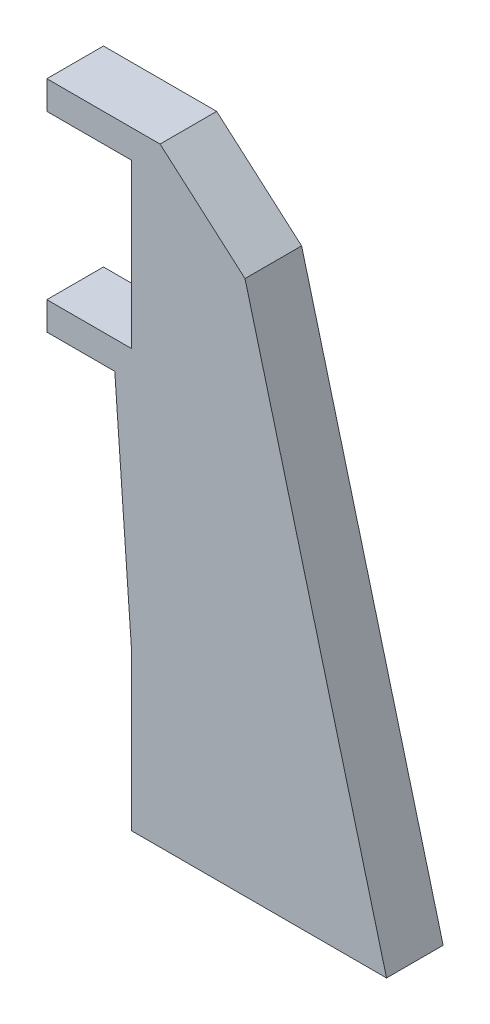
ISO-10303-21;
HEADER;
FILE_DESCRIPTION(('STEP AP214'),'2;1');
FILE_NAME('part.step','',(''),(''),'','','');
FILE_SCHEMA(('AUTOMOTIVE_DESIGN { 1 0 10303 214 1 1 1 1 }'));
ENDSEC;
DATA;
#1=APPLICATION_CONTEXT('core data for automotive mechanical design processes');
#2=APPLICATION_PROTOCOL_DEFINITION('international standard','automotive_design',2000,#1);
#3=PRODUCT_CONTEXT('',#1,'mechanical');
#4=PRODUCT('Part','Part','',(#3));
#5=PRODUCT_RELATED_PRODUCT_CATEGORY('part','',(#4));
#6=PRODUCT_DEFINITION_FORMATION('','',#4);
#7=PRODUCT_DEFINITION_CONTEXT('part definition',#1,'design');
#8=PRODUCT_DEFINITION('design','',#6,#7);
#9=PRODUCT_DEFINITION_SHAPE('','',#8);
#10=(LENGTH_UNIT() NAMED_UNIT(*) SI_UNIT(.MILLI.,.METRE.));
#11=(NAMED_UNIT(*) PLANE_ANGLE_UNIT() SI_UNIT($,.RADIAN.));
#12=(NAMED_UNIT(*) SI_UNIT($,.STERADIAN.) SOLID_ANGLE_UNIT());
#13=UNCERTAINTY_MEASURE_WITH_UNIT(LENGTH_MEASURE(1.E-05),#10,'distance_accuracy_value','');
#14=(GEOMETRIC_REPRESENTATION_CONTEXT(3) GLOBAL_UNCERTAINTY_ASSIGNED_CONTEXT((#13)) GLOBAL_UNIT_ASSIGNED_CONTEXT((#10,
#11,#12)) REPRESENTATION_CONTEXT('',''));
#15=CARTESIAN_POINT('',(0.,0.,0.));
#16=DIRECTION('',(0.,0.,1.));
#17=DIRECTION('',(1.,0.,0.));
#18=AXIS2_PLACEMENT_3D('',#15,#16,#17);
#19=CARTESIAN_POINT('',(0.,0.,25.4));
#20=DIRECTION('',(0.,1.,0.));
#21=DIRECTION('',(0.,0.,1.));
#22=AXIS2_PLACEMENT_3D('',#19,#20,#21);
#23=PLANE('',#22);
#24=DIRECTION('',(1.,0.,0.));
#25=VECTOR('',#24,1.);
#26=CARTESIAN_POINT('',(0.,0.,0.));
#27=LINE('',#26,#25);
#28=CARTESIAN_POINT('',(0.,0.,0.));
#29=VERTEX_POINT('',#28);
#30=CARTESIAN_POINT('',(38.0186594192209,0.,0.));
#31=VERTEX_POINT('',#30);
#32=EDGE_CURVE('E164',#29,#31,#27,.T.);
#33=ORIENTED_EDGE('',*,*,#32,.T.);
#34=DIRECTION('',(0.,0.,-1.));
#35=VECTOR('',#34,1.);
#36=CARTESIAN_POINT('',(38.0186594192209,0.,25.4));
#37=LINE('',#36,#35);
#38=CARTESIAN_POINT('',(38.0186594192209,0.,25.4));
#39=VERTEX_POINT('',#38);
#40=EDGE_CURVE('E11',#39,#31,#37,.T.);
#41=ORIENTED_EDGE('',*,*,#40,.F.);
#42=DIRECTION('',(1.,0.,0.));
#43=VECTOR('',#42,1.);
#44=CARTESIAN_POINT('',(0.,0.,25.4));
#45=LINE('',#44,#43);
#46=CARTESIAN_POINT('',(0.,0.,25.4));
#47=VERTEX_POINT('',#46);
#48=EDGE_CURVE('E198',#47,#39,#45,.T.);
#49=ORIENTED_EDGE('',*,*,#48,.F.);
#50=DIRECTION('',(0.,0.,-1.));
#51=VECTOR('',#50,1.);
#52=CARTESIAN_POINT('',(0.,0.,25.4));
#53=LINE('',#52,#51);
#54=EDGE_CURVE('E160',#47,#29,#53,.T.);
#55=ORIENTED_EDGE('',*,*,#54,.T.);
#56=EDGE_LOOP('',(#33,#41,#49,#55));
#57=FACE_BOUND('',#56,.T.);
#58=ADVANCED_FACE('F39',(#57),#23,.F.);
#59=CARTESIAN_POINT('',(38.0186594192209,0.,25.4));
#60=DIRECTION('',(1.,0.,0.));
#61=DIRECTION('',(0.,0.,-1.));
#62=AXIS2_PLACEMENT_3D('',#59,#60,#61);
#63=PLANE('',#62);
#64=DIRECTION('',(0.,-1.,0.));
#65=VECTOR('',#64,1.);
#66=CARTESIAN_POINT('',(38.0186594192209,0.,0.));
#67=LINE('',#66,#65);
#68=CARTESIAN_POINT('',(38.0186594192209,-73.1522603664943,0.));
#69=VERTEX_POINT('',#68);
#70=EDGE_CURVE('E168',#31,#69,#67,.T.);
#71=ORIENTED_EDGE('',*,*,#70,.T.);
#72=DIRECTION('',(0.,0.,-1.));
#73=VECTOR('',#72,1.);
#74=CARTESIAN_POINT('',(38.0186594192209,-73.1522603664943,25.4));
#75=LINE('',#74,#73);
#76=CARTESIAN_POINT('',(38.0186594192209,-73.1522603664943,25.4));
#77=VERTEX_POINT('',#76);
#78=EDGE_CURVE('E48',#77,#69,#75,.T.);
#79=ORIENTED_EDGE('',*,*,#78,.F.);
#80=DIRECTION('',(0.,-1.,0.));
#81=VECTOR('',#80,1.);
#82=CARTESIAN_POINT('',(38.0186594192209,0.,25.4));
#83=LINE('',#82,#81);
#84=EDGE_CURVE('E111',#39,#77,#83,.T.);
#85=ORIENTED_EDGE('',*,*,#84,.F.);
#86=ORIENTED_EDGE('',*,*,#40,.T.);
#87=EDGE_LOOP('',(#71,#79,#85,#86));
#88=FACE_BOUND('',#87,.T.);
#89=ADVANCED_FACE('F292',(#88),#63,.F.);
#90=CARTESIAN_POINT('',(38.0186594192209,-73.1522603664943,25.4));
#91=DIRECTION('',(0.,-1.,0.));
#92=DIRECTION('',(0.,0.,-1.));
#93=AXIS2_PLACEMENT_3D('',#90,#91,#92);
#94=PLANE('',#93);
#95=DIRECTION('',(-1.,0.,0.));
#96=VECTOR('',#95,1.);
#97=CARTESIAN_POINT('',(38.0186594192209,-73.1522603664943,0.));
#98=LINE('',#97,#96);
#99=CARTESIAN_POINT('',(0.,-73.1522603664943,0.));
#100=VERTEX_POINT('',#99);
#101=EDGE_CURVE('E171',#69,#100,#98,.T.);
#102=ORIENTED_EDGE('',*,*,#101,.T.);
#103=DIRECTION('',(0.,0.,-1.));
#104=VECTOR('',#103,1.);
#105=CARTESIAN_POINT('',(0.,-73.1522603664943,25.4));
#106=LINE('',#105,#104);
#107=CARTESIAN_POINT('',(0.,-73.1522603664943,25.4));
#108=VERTEX_POINT('',#107);
#109=EDGE_CURVE('E225',#108,#100,#106,.T.);
#110=ORIENTED_EDGE('',*,*,#109,.F.);
#111=DIRECTION('',(-1.,0.,0.));
#112=VECTOR('',#111,1.);
#113=CARTESIAN_POINT('',(38.0186594192209,-73.1522603664943,25.4));
#114=LINE('',#113,#112);
#115=EDGE_CURVE('E235',#77,#108,#114,.T.);
#116=ORIENTED_EDGE('',*,*,#115,.F.);
#117=ORIENTED_EDGE('',*,*,#78,.T.);
#118=EDGE_LOOP('',(#102,#110,#116,#117));
#119=FACE_BOUND('',#118,.T.);
#120=ADVANCED_FACE('F233',(#119),#94,.F.);
#121=CARTESIAN_POINT('',(0.,-73.1522603664943,25.4));
#122=DIRECTION('',(1.,0.,0.));
#123=DIRECTION('',(0.,0.,-1.));
#124=AXIS2_PLACEMENT_3D('',#121,#122,#123);
#125=PLANE('',#124);
#126=DIRECTION('',(0.,-1.,0.));
#127=VECTOR('',#126,1.);
#128=CARTESIAN_POINT('',(0.,-73.1522603664943,0.));
#129=LINE('',#128,#127);
#130=CARTESIAN_POINT('',(0.,-85.7639267927339,0.));
#131=VERTEX_POINT('',#130);
#132=EDGE_CURVE('E174',#100,#131,#129,.T.);
#133=ORIENTED_EDGE('',*,*,#132,.T.);
#134=DIRECTION('',(0.,0.,-1.));
#135=VECTOR('',#134,1.);
#136=CARTESIAN_POINT('',(0.,-85.7639267927339,25.4));
#137=LINE('',#136,#135);
#138=CARTESIAN_POINT('',(0.,-85.7639267927339,25.4));
#139=VERTEX_POINT('',#138);
#140=EDGE_CURVE('E221',#139,#131,#137,.T.);
#141=ORIENTED_EDGE('',*,*,#140,.F.);
#142=DIRECTION('',(0.,-1.,0.));
#143=VECTOR('',#142,1.);
#144=CARTESIAN_POINT('',(0.,-73.1522603664943,25.4));
#145=LINE('',#144,#143);
#146=EDGE_CURVE('E254',#108,#139,#145,.T.);
#147=ORIENTED_EDGE('',*,*,#146,.F.);
#148=ORIENTED_EDGE('',*,*,#109,.T.);
#149=EDGE_LOOP('',(#133,#141,#147,#148));
#150=FACE_BOUND('',#149,.T.);
#151=ADVANCED_FACE('F244',(#150),#125,.F.);
#152=CARTESIAN_POINT('',(0.,-85.7639267927339,25.4));
#153=DIRECTION('',(0.,1.,0.));
#154=DIRECTION('',(0.,0.,1.));
#155=AXIS2_PLACEMENT_3D('',#152,#153,#154);
#156=PLANE('',#155);
#157=DIRECTION('',(1.,0.,0.));
#158=VECTOR('',#157,1.);
#159=CARTESIAN_POINT('',(0.,-85.7639267927339,0.));
#160=LINE('',#159,#158);
#161=CARTESIAN_POINT('',(30.48,-85.7639267927339,0.));
#162=VERTEX_POINT('',#161);
#163=EDGE_CURVE('E177',#131,#162,#160,.T.);
#164=ORIENTED_EDGE('',*,*,#163,.T.);
#165=DIRECTION('',(0.,0.,-1.));
#166=VECTOR('',#165,1.);
#167=CARTESIAN_POINT('',(30.48,-85.7639267927339,25.4));
#168=LINE('',#167,#166);
#169=CARTESIAN_POINT('',(30.48,-85.7639267927339,25.4));
#170=VERTEX_POINT('',#169);
#171=EDGE_CURVE('E217',#170,#162,#168,.T.);
#172=ORIENTED_EDGE('',*,*,#171,.F.);
#173=DIRECTION('',(1.,0.,0.));
#174=VECTOR('',#173,1.);
#175=CARTESIAN_POINT('',(0.,-85.7639267927339,25.4));
#176=LINE('',#175,#174);
#177=EDGE_CURVE('E250',#139,#170,#176,.T.);
#178=ORIENTED_EDGE('',*,*,#177,.F.);
#179=ORIENTED_EDGE('',*,*,#140,.T.);
#180=EDGE_LOOP('',(#164,#172,#178,#179));
#181=FACE_BOUND('',#180,.T.);
#182=ADVANCED_FACE('F248',(#181),#156,.F.);
#183=CARTESIAN_POINT('',(30.48,-85.7639267927339,25.4));
#184=DIRECTION('',(0.997429246927339,0.071658198232729,0.));
#185=DIRECTION('',(-0.071658198232729,0.997429246927339,0.));
#186=AXIS2_PLACEMENT_3D('',#183,#184,#185);
#187=PLANE('',#186);
#188=DIRECTION('',(0.071658198232729,-0.997429246927339,0.));
#189=VECTOR('',#188,1.);
#190=CARTESIAN_POINT('',(30.48,-85.7639267927339,0.));
#191=LINE('',#190,#189);
#192=CARTESIAN_POINT('',(38.0186594192209,-190.696503564123,0.));
#193=VERTEX_POINT('',#192);
#194=EDGE_CURVE('E180',#162,#193,#191,.T.);
#195=ORIENTED_EDGE('',*,*,#194,.T.);
#196=DIRECTION('',(0.,0.,-1.));
#197=VECTOR('',#196,1.);
#198=CARTESIAN_POINT('',(38.0186594192209,-190.696503564123,25.4));
#199=LINE('',#198,#197);
#200=CARTESIAN_POINT('',(38.0186594192209,-190.696503564123,25.4));
#201=VERTEX_POINT('',#200);
#202=EDGE_CURVE('E213',#201,#193,#199,.T.);
#203=ORIENTED_EDGE('',*,*,#202,.F.);
#204=DIRECTION('',(0.071658198232729,-0.997429246927339,0.));
#205=VECTOR('',#204,1.);
#206=CARTESIAN_POINT('',(30.48,-85.7639267927339,25.4));
#207=LINE('',#206,#205);
#208=EDGE_CURVE('E253',#170,#201,#207,.T.);
#209=ORIENTED_EDGE('',*,*,#208,.F.);
#210=ORIENTED_EDGE('',*,*,#171,.T.);
#211=EDGE_LOOP('',(#195,#203,#209,#210));
#212=FACE_BOUND('',#211,.T.);
#213=ADVANCED_FACE('F305',(#212),#187,.F.);
#214=CARTESIAN_POINT('',(38.0186594192209,-190.696503564123,25.4));
#215=DIRECTION('',(1.,0.,0.));
#216=DIRECTION('',(0.,0.,-1.));
#217=AXIS2_PLACEMENT_3D('',#214,#215,#216);
#218=PLANE('',#217);
#219=DIRECTION('',(0.,-1.,0.));
#220=VECTOR('',#219,1.);
#221=CARTESIAN_POINT('',(38.0186594192209,-190.696503564123,0.));
#222=LINE('',#221,#220);
#223=CARTESIAN_POINT('',(38.0186594192209,-260.515926792734,0.));
#224=VERTEX_POINT('',#223);
#225=EDGE_CURVE('E183',#193,#224,#222,.T.);
#226=ORIENTED_EDGE('',*,*,#225,.T.);
#227=DIRECTION('',(0.,0.,-1.));
#228=VECTOR('',#227,1.);
#229=CARTESIAN_POINT('',(38.0186594192209,-260.515926792734,25.4));
#230=LINE('',#229,#228);
#231=CARTESIAN_POINT('',(38.0186594192209,-260.515926792734,25.4));
#232=VERTEX_POINT('',#231);
#233=EDGE_CURVE('E209',#232,#224,#230,.T.);
#234=ORIENTED_EDGE('',*,*,#233,.F.);
#235=DIRECTION('',(0.,-1.,0.));
#236=VECTOR('',#235,1.);
#237=CARTESIAN_POINT('',(38.0186594192209,-190.696503564123,25.4));
#238=LINE('',#237,#236);
#239=EDGE_CURVE('E258',#201,#232,#238,.T.);
#240=ORIENTED_EDGE('',*,*,#239,.F.);
#241=ORIENTED_EDGE('',*,*,#202,.T.);
#242=EDGE_LOOP('',(#226,#234,#240,#241));
#243=FACE_BOUND('',#242,.T.);
#244=ADVANCED_FACE('F308',(#243),#218,.F.);
#245=CARTESIAN_POINT('',(38.0186594192209,-260.515926792734,25.4));
#246=DIRECTION('',(0.,1.,0.));
#247=DIRECTION('',(-1.,0.,0.));
#248=AXIS2_PLACEMENT_3D('',#245,#246,#247);
#249=PLANE('',#248);
#250=DIRECTION('',(1.,0.,0.));
#251=VECTOR('',#250,1.);
#252=CARTESIAN_POINT('',(38.0186594192209,-260.515926792734,0.));
#253=LINE('',#252,#251);
#254=CARTESIAN_POINT('',(152.4,-260.515926792734,0.));
#255=VERTEX_POINT('',#254);
#256=EDGE_CURVE('E186',#224,#255,#253,.T.);
#257=ORIENTED_EDGE('',*,*,#256,.T.);
#258=DIRECTION('',(0.,0.,-1.));
#259=VECTOR('',#258,1.);
#260=CARTESIAN_POINT('',(152.4,-260.515926792734,25.4));
#261=LINE('',#260,#259);
#262=CARTESIAN_POINT('',(152.4,-260.515926792734,25.4));
#263=VERTEX_POINT('',#262);
#264=EDGE_CURVE('E205',#263,#255,#261,.T.);
#265=ORIENTED_EDGE('',*,*,#264,.F.);
#266=DIRECTION('',(1.,0.,0.));
#267=VECTOR('',#266,1.);
#268=CARTESIAN_POINT('',(38.0186594192209,-260.515926792734,25.4));
#269=LINE('',#268,#267);
#270=EDGE_CURVE('E265',#232,#263,#269,.T.);
#271=ORIENTED_EDGE('',*,*,#270,.F.);
#272=ORIENTED_EDGE('',*,*,#233,.T.);
#273=EDGE_LOOP('',(#257,#265,#271,#272));
#274=FACE_BOUND('',#273,.T.);
#275=ADVANCED_FACE('F273',(#274),#249,.F.);
#276=CARTESIAN_POINT('',(152.4,-260.515926792734,25.4));
#277=DIRECTION('',(-0.966736029953068,-0.255776168535266,0.));
#278=DIRECTION('',(0.255776168535266,-0.966736029953068,0.));
#279=AXIS2_PLACEMENT_3D('',#276,#277,#278);
#280=PLANE('',#279);
#281=DIRECTION('',(-0.255776168535266,0.966736029953068,0.));
#282=VECTOR('',#281,1.);
#283=CARTESIAN_POINT('',(152.4,-260.515926792734,0.));
#284=LINE('',#283,#282);
#285=CARTESIAN_POINT('',(88.9,-20.5102286326416,0.));
#286=VERTEX_POINT('',#285);
#287=EDGE_CURVE('E189',#255,#286,#284,.T.);
#288=ORIENTED_EDGE('',*,*,#287,.T.);
#289=DIRECTION('',(0.,0.,-1.));
#290=VECTOR('',#289,1.);
#291=CARTESIAN_POINT('',(88.9,-20.5102286326416,25.4));
#292=LINE('',#291,#290);
#293=CARTESIAN_POINT('',(88.9,-20.5102286326416,25.4));
#294=VERTEX_POINT('',#293);
#295=EDGE_CURVE('E153',#294,#286,#292,.T.);
#296=ORIENTED_EDGE('',*,*,#295,.F.);
#297=DIRECTION('',(-0.255776168535266,0.966736029953068,0.));
#298=VECTOR('',#297,1.);
#299=CARTESIAN_POINT('',(152.4,-260.515926792734,25.4));
#300=LINE('',#299,#298);
#301=EDGE_CURVE('E142',#263,#294,#300,.T.);
#302=ORIENTED_EDGE('',*,*,#301,.F.);
#303=ORIENTED_EDGE('',*,*,#264,.T.);
#304=EDGE_LOOP('',(#288,#296,#302,#303));
#305=FACE_BOUND('',#304,.T.);
#306=ADVANCED_FACE('F277',(#305),#280,.F.);
#307=CARTESIAN_POINT('',(50.8,12.7,25.4));
#308=DIRECTION('',(-0.657077237358178,-0.753823257896534,0.));
#309=DIRECTION('',(0.753823257896534,-0.657077237358178,0.));
#310=AXIS2_PLACEMENT_3D('',#307,#308,#309);
#311=PLANE('',#310);
#312=DIRECTION('',(-0.753823257896534,0.657077237358178,0.));
#313=VECTOR('',#312,1.);
#314=CARTESIAN_POINT('',(50.8,12.7,0.));
#315=LINE('',#314,#313);
#316=CARTESIAN_POINT('',(50.8,12.7,0.));
#317=VERTEX_POINT('',#316);
#318=EDGE_CURVE('E151',#286,#317,#315,.T.);
#319=ORIENTED_EDGE('',*,*,#318,.T.);
#320=DIRECTION('',(0.,0.,-1.));
#321=VECTOR('',#320,1.);
#322=CARTESIAN_POINT('',(50.8,12.7,25.4));
#323=LINE('',#322,#321);
#324=CARTESIAN_POINT('',(50.8,12.7,25.4));
#325=VERTEX_POINT('',#324);
#326=EDGE_CURVE('E148',#325,#317,#323,.T.);
#327=ORIENTED_EDGE('',*,*,#326,.F.);
#328=DIRECTION('',(-0.753823257896534,0.657077237358178,0.));
#329=VECTOR('',#328,1.);
#330=CARTESIAN_POINT('',(50.8,12.7,25.4));
#331=LINE('',#330,#329);
#332=EDGE_CURVE('E136',#294,#325,#331,.T.);
#333=ORIENTED_EDGE('',*,*,#332,.F.);
#334=ORIENTED_EDGE('',*,*,#295,.T.);
#335=EDGE_LOOP('',(#319,#327,#333,#334));
#336=FACE_BOUND('',#335,.T.);
#337=ADVANCED_FACE('F149',(#336),#311,.F.);
#338=CARTESIAN_POINT('',(0.,12.7,25.4));
#339=DIRECTION('',(0.,-1.,0.));
#340=DIRECTION('',(0.,0.,-1.));
#341=AXIS2_PLACEMENT_3D('',#338,#339,#340);
#342=PLANE('',#341);
#343=DIRECTION('',(-1.,0.,0.));
#344=VECTOR('',#343,1.);
#345=CARTESIAN_POINT('',(0.,12.7,0.));
#346=LINE('',#345,#344);
#347=CARTESIAN_POINT('',(0.,12.7,0.));
#348=VERTEX_POINT('',#347);
#349=EDGE_CURVE('E97',#317,#348,#346,.T.);
#350=ORIENTED_EDGE('',*,*,#349,.T.);
#351=DIRECTION('',(0.,0.,-1.));
#352=VECTOR('',#351,1.);
#353=CARTESIAN_POINT('',(0.,12.7,25.4));
#354=LINE('',#353,#352);
#355=CARTESIAN_POINT('',(0.,12.7,25.4));
#356=VERTEX_POINT('',#355);
#357=EDGE_CURVE('E154',#356,#348,#354,.T.);
#358=ORIENTED_EDGE('',*,*,#357,.F.);
#359=DIRECTION('',(-1.,0.,0.));
#360=VECTOR('',#359,1.);
#361=CARTESIAN_POINT('',(0.,12.7,25.4));
#362=LINE('',#361,#360);
#363=EDGE_CURVE('E140',#325,#356,#362,.T.);
#364=ORIENTED_EDGE('',*,*,#363,.F.);
#365=ORIENTED_EDGE('',*,*,#326,.T.);
#366=EDGE_LOOP('',(#350,#358,#364,#365));
#367=FACE_BOUND('',#366,.T.);
#368=ADVANCED_FACE('F156',(#367),#342,.F.);
#369=CARTESIAN_POINT('',(0.,0.,25.4));
#370=DIRECTION('',(1.,0.,0.));
#371=DIRECTION('',(0.,0.,-1.));
#372=AXIS2_PLACEMENT_3D('',#369,#370,#371);
#373=PLANE('',#372);
#374=DIRECTION('',(0.,-1.,0.));
#375=VECTOR('',#374,1.);
#376=CARTESIAN_POINT('',(0.,0.,0.));
#377=LINE('',#376,#375);
#378=EDGE_CURVE('E103',#348,#29,#377,.T.);
#379=ORIENTED_EDGE('',*,*,#378,.T.);
#380=ORIENTED_EDGE('',*,*,#54,.F.);
#381=DIRECTION('',(0.,-1.,0.));
#382=VECTOR('',#381,1.);
#383=CARTESIAN_POINT('',(0.,0.,25.4));
#384=LINE('',#383,#382);
#385=EDGE_CURVE('E56',#356,#47,#384,.T.);
#386=ORIENTED_EDGE('',*,*,#385,.F.);
#387=ORIENTED_EDGE('',*,*,#357,.T.);
#388=EDGE_LOOP('',(#379,#380,#386,#387));
#389=FACE_BOUND('',#388,.T.);
#390=ADVANCED_FACE('F281',(#389),#373,.F.);
#391=CARTESIAN_POINT('',(0.,0.,25.4));
#392=DIRECTION('',(0.,0.,-1.));
#393=DIRECTION('',(-1.,0.,0.));
#394=AXIS2_PLACEMENT_3D('',#391,#392,#393);
#395=PLANE('',#394);
#396=ORIENTED_EDGE('',*,*,#48,.T.);
#397=ORIENTED_EDGE('',*,*,#84,.T.);
#398=ORIENTED_EDGE('',*,*,#115,.T.);
#399=ORIENTED_EDGE('',*,*,#146,.T.);
#400=ORIENTED_EDGE('',*,*,#177,.T.);
#401=ORIENTED_EDGE('',*,*,#208,.T.);
#402=ORIENTED_EDGE('',*,*,#239,.T.);
#403=ORIENTED_EDGE('',*,*,#270,.T.);
#404=ORIENTED_EDGE('',*,*,#301,.T.);
#405=ORIENTED_EDGE('',*,*,#332,.T.);
#406=ORIENTED_EDGE('',*,*,#363,.T.);
#407=ORIENTED_EDGE('',*,*,#385,.T.);
#408=EDGE_LOOP('',(#396,#397,#398,#399,#400,#401,#402,#403,#404,#405,#406,#407));
#409=FACE_BOUND('',#408,.T.);
#410=ADVANCED_FACE('F138',(#409),#395,.F.);
#411=CARTESIAN_POINT('',(0.,0.,0.));
#412=DIRECTION('',(0.,0.,-1.));
#413=DIRECTION('',(-1.,0.,0.));
#414=AXIS2_PLACEMENT_3D('',#411,#412,#413);
#415=PLANE('',#414);
#416=ORIENTED_EDGE('',*,*,#32,.F.);
#417=ORIENTED_EDGE('',*,*,#378,.F.);
#418=ORIENTED_EDGE('',*,*,#349,.F.);
#419=ORIENTED_EDGE('',*,*,#318,.F.);
#420=ORIENTED_EDGE('',*,*,#287,.F.);
#421=ORIENTED_EDGE('',*,*,#256,.F.);
#422=ORIENTED_EDGE('',*,*,#225,.F.);
#423=ORIENTED_EDGE('',*,*,#194,.F.);
#424=ORIENTED_EDGE('',*,*,#163,.F.);
#425=ORIENTED_EDGE('',*,*,#132,.F.);
#426=ORIENTED_EDGE('',*,*,#101,.F.);
#427=ORIENTED_EDGE('',*,*,#70,.F.);
#428=EDGE_LOOP('',(#416,#417,#418,#419,#420,#421,#422,#423,#424,#425,#426,#427));
#429=FACE_BOUND('',#428,.T.);
#430=ADVANCED_FACE('F239',(#429),#415,.T.);
#431=CLOSED_SHELL('',(#58,#89,#120,#151,#182,#213,#244,#275,#306,#337,#368,#390,#410,#430));
#432=MANIFOLD_SOLID_BREP('B2',#431);
#433=ADVANCED_BREP_SHAPE_REPRESENTATION('',(#18,#432),#14);
#434=SHAPE_DEFINITION_REPRESENTATION(#9,#433);
ENDSEC;
END-ISO-10303-21;
